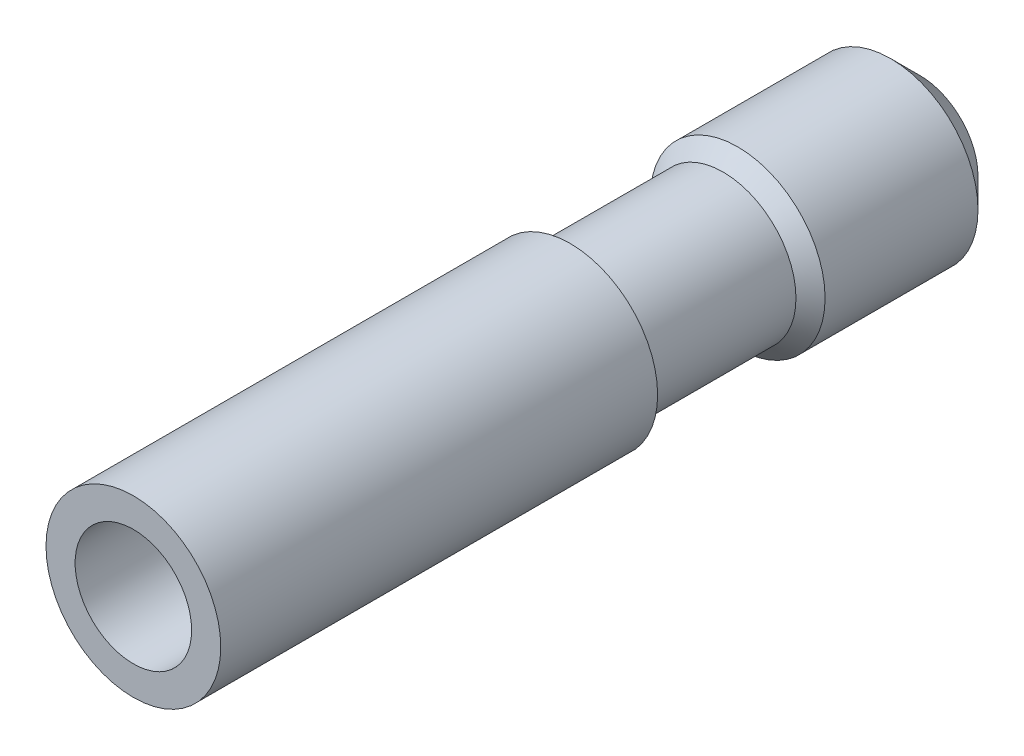
ISO-10303-21;
HEADER;
FILE_DESCRIPTION(('STEP AP214'),'2;1');
FILE_NAME('part.step','',(''),(''),'','','');
FILE_SCHEMA(('AUTOMOTIVE_DESIGN { 1 0 10303 214 1 1 1 1 }'));
ENDSEC;
DATA;
#1=APPLICATION_CONTEXT('core data for automotive mechanical design processes');
#2=APPLICATION_PROTOCOL_DEFINITION('international standard','automotive_design',2000,#1);
#3=PRODUCT_CONTEXT('',#1,'mechanical');
#4=PRODUCT('Part','Part','',(#3));
#5=PRODUCT_RELATED_PRODUCT_CATEGORY('part','',(#4));
#6=PRODUCT_DEFINITION_FORMATION('','',#4);
#7=PRODUCT_DEFINITION_CONTEXT('part definition',#1,'design');
#8=PRODUCT_DEFINITION('design','',#6,#7);
#9=PRODUCT_DEFINITION_SHAPE('','',#8);
#10=(LENGTH_UNIT() NAMED_UNIT(*) SI_UNIT(.MILLI.,.METRE.));
#11=(NAMED_UNIT(*) PLANE_ANGLE_UNIT() SI_UNIT($,.RADIAN.));
#12=(NAMED_UNIT(*) SI_UNIT($,.STERADIAN.) SOLID_ANGLE_UNIT());
#13=UNCERTAINTY_MEASURE_WITH_UNIT(LENGTH_MEASURE(1.E-05),#10,'distance_accuracy_value','');
#14=(GEOMETRIC_REPRESENTATION_CONTEXT(3) GLOBAL_UNCERTAINTY_ASSIGNED_CONTEXT((#13)) GLOBAL_UNIT_ASSIGNED_CONTEXT((#10,
#11,#12)) REPRESENTATION_CONTEXT('',''));
#15=CARTESIAN_POINT('',(0.,0.,0.));
#16=DIRECTION('',(0.,0.,1.));
#17=DIRECTION('',(1.,0.,0.));
#18=AXIS2_PLACEMENT_3D('',#15,#16,#17);
#19=CARTESIAN_POINT('',(0.,0.,27.));
#20=DIRECTION('',(0.,0.,-1.));
#21=DIRECTION('',(-1.,0.,0.));
#22=AXIS2_PLACEMENT_3D('',#19,#20,#21);
#23=CYLINDRICAL_SURFACE('',#22,3.);
#24=CARTESIAN_POINT('',(0.,0.,27.));
#25=DIRECTION('',(0.,0.,1.));
#26=DIRECTION('',(1.,0.,0.));
#27=AXIS2_PLACEMENT_3D('',#24,#25,#26);
#28=CIRCLE('',#27,3.);
#29=CARTESIAN_POINT('',(3.,0.,27.));
#30=VERTEX_POINT('',#29);
#31=EDGE_CURVE('E55',#30,#30,#28,.T.);
#32=ORIENTED_EDGE('',*,*,#31,.F.);
#33=EDGE_LOOP('',(#32));
#34=FACE_BOUND('',#33,.T.);
#35=CARTESIAN_POINT('',(0.,0.,12.));
#36=DIRECTION('',(0.,0.,-1.));
#37=DIRECTION('',(-1.,0.,0.));
#38=AXIS2_PLACEMENT_3D('',#35,#36,#37);
#39=CIRCLE('',#38,3.);
#40=CARTESIAN_POINT('',(-3.,0.,12.));
#41=VERTEX_POINT('',#40);
#42=EDGE_CURVE('E56',#41,#41,#39,.T.);
#43=ORIENTED_EDGE('',*,*,#42,.F.);
#44=EDGE_LOOP('',(#43));
#45=FACE_BOUND('',#44,.T.);
#46=ADVANCED_FACE('F35',(#34,#45),#23,.T.);
#47=CARTESIAN_POINT('',(0.,0.,6.25000000000001));
#48=DIRECTION('',(0.,0.,-1.));
#49=DIRECTION('',(-1.,0.,0.));
#50=AXIS2_PLACEMENT_3D('',#47,#48,#49);
#51=CIRCLE('',#50,3.);
#52=CARTESIAN_POINT('',(-3.,0.,6.25000000000001));
#53=VERTEX_POINT('',#52);
#54=EDGE_CURVE('E10',#53,#53,#51,.T.);
#55=ORIENTED_EDGE('',*,*,#54,.T.);
#56=EDGE_LOOP('',(#55));
#57=FACE_BOUND('',#56,.T.);
#58=CARTESIAN_POINT('',(0.,0.,1.));
#59=DIRECTION('',(0.,0.,1.));
#60=DIRECTION('',(1.,0.,0.));
#61=AXIS2_PLACEMENT_3D('',#58,#59,#60);
#62=CIRCLE('',#61,3.);
#63=CARTESIAN_POINT('',(3.,0.,1.));
#64=VERTEX_POINT('',#63);
#65=EDGE_CURVE('E50',#64,#64,#62,.T.);
#66=ORIENTED_EDGE('',*,*,#65,.T.);
#67=EDGE_LOOP('',(#66));
#68=FACE_BOUND('',#67,.T.);
#69=ADVANCED_FACE('F92',(#57,#68),#23,.T.);
#70=CARTESIAN_POINT('',(0.,0.,27.));
#71=DIRECTION('',(0.,0.,1.));
#72=DIRECTION('',(1.,0.,0.));
#73=AXIS2_PLACEMENT_3D('',#70,#71,#72);
#74=PLANE('',#73);
#75=CARTESIAN_POINT('',(0.,0.,27.));
#76=DIRECTION('',(0.,0.,1.));
#77=DIRECTION('',(1.,0.,0.));
#78=AXIS2_PLACEMENT_3D('',#75,#76,#77);
#79=CIRCLE('',#78,2.);
#80=CARTESIAN_POINT('',(2.,0.,27.));
#81=VERTEX_POINT('',#80);
#82=EDGE_CURVE('E66',#81,#81,#79,.T.);
#83=ORIENTED_EDGE('',*,*,#82,.F.);
#84=EDGE_LOOP('',(#83));
#85=FACE_BOUND('',#84,.T.);
#86=ORIENTED_EDGE('',*,*,#31,.T.);
#87=EDGE_LOOP('',(#86));
#88=FACE_BOUND('',#87,.T.);
#89=ADVANCED_FACE('F98',(#85,#88),#74,.T.);
#90=CARTESIAN_POINT('',(0.,0.,0.));
#91=DIRECTION('',(0.,0.,1.));
#92=DIRECTION('',(1.,0.,0.));
#93=AXIS2_PLACEMENT_3D('',#90,#91,#92);
#94=PLANE('',#93);
#95=CARTESIAN_POINT('',(0.,0.,0.));
#96=DIRECTION('',(0.,0.,1.));
#97=DIRECTION('',(1.,0.,0.));
#98=AXIS2_PLACEMENT_3D('',#95,#96,#97);
#99=CIRCLE('',#98,2.);
#100=CARTESIAN_POINT('',(2.,0.,0.));
#101=VERTEX_POINT('',#100);
#102=EDGE_CURVE('E46',#101,#101,#99,.F.);
#103=ORIENTED_EDGE('',*,*,#102,.T.);
#104=EDGE_LOOP('',(#103));
#105=FACE_BOUND('',#104,.T.);
#106=CARTESIAN_POINT('',(0.,0.,0.));
#107=DIRECTION('',(0.,0.,-1.));
#108=DIRECTION('',(-1.,0.,0.));
#109=AXIS2_PLACEMENT_3D('',#106,#107,#108);
#110=CIRCLE('',#109,1.25);
#111=CARTESIAN_POINT('',(-1.25,0.,0.));
#112=VERTEX_POINT('',#111);
#113=EDGE_CURVE('E59',#112,#112,#110,.T.);
#114=ORIENTED_EDGE('',*,*,#113,.F.);
#115=EDGE_LOOP('',(#114));
#116=FACE_BOUND('',#115,.T.);
#117=ADVANCED_FACE('F102',(#105,#116),#94,.F.);
#118=CARTESIAN_POINT('',(0.,0.,2.5));
#119=DIRECTION('',(0.,0.,1.));
#120=DIRECTION('',(1.,0.,0.));
#121=AXIS2_PLACEMENT_3D('',#118,#119,#120);
#122=CONICAL_SURFACE('',#121,1.99999999999999,1.02974425867665);
#123=CARTESIAN_POINT('',(0.,0.,2.04935453572933));
#124=DIRECTION('',(0.,0.,1.));
#125=DIRECTION('',(1.,0.,0.));
#126=AXIS2_PLACEMENT_3D('',#123,#124,#125);
#127=CIRCLE('',#126,1.25);
#128=CARTESIAN_POINT('',(1.25,0.,2.04935453572933));
#129=VERTEX_POINT('',#128);
#130=EDGE_CURVE('E69',#129,#129,#127,.F.);
#131=ORIENTED_EDGE('',*,*,#130,.T.);
#132=EDGE_LOOP('',(#131));
#133=FACE_BOUND('',#132,.T.);
#134=CARTESIAN_POINT('',(0.,0.,2.5));
#135=DIRECTION('',(0.,0.,1.));
#136=DIRECTION('',(1.,0.,0.));
#137=AXIS2_PLACEMENT_3D('',#134,#135,#136);
#138=CIRCLE('',#137,1.99999999999999);
#139=CARTESIAN_POINT('',(1.99999999999999,0.,2.5));
#140=VERTEX_POINT('',#139);
#141=EDGE_CURVE('E63',#140,#140,#138,.T.);
#142=ORIENTED_EDGE('',*,*,#141,.T.);
#143=EDGE_LOOP('',(#142));
#144=FACE_BOUND('',#143,.T.);
#145=ADVANCED_FACE('F105',(#133,#144),#122,.F.);
#146=CARTESIAN_POINT('',(0.,0.,27.));
#147=DIRECTION('',(0.,0.,1.));
#148=DIRECTION('',(1.,0.,0.));
#149=AXIS2_PLACEMENT_3D('',#146,#147,#148);
#150=CYLINDRICAL_SURFACE('',#149,2.);
#151=ORIENTED_EDGE('',*,*,#141,.F.);
#152=EDGE_LOOP('',(#151));
#153=FACE_BOUND('',#152,.T.);
#154=ORIENTED_EDGE('',*,*,#82,.T.);
#155=EDGE_LOOP('',(#154));
#156=FACE_BOUND('',#155,.T.);
#157=ADVANCED_FACE('F112',(#153,#156),#150,.F.);
#158=CARTESIAN_POINT('',(0.,0.,0.));
#159=DIRECTION('',(0.,0.,-1.));
#160=DIRECTION('',(-1.,0.,0.));
#161=AXIS2_PLACEMENT_3D('',#158,#159,#160);
#162=CYLINDRICAL_SURFACE('',#161,1.25);
#163=ORIENTED_EDGE('',*,*,#113,.T.);
#164=EDGE_LOOP('',(#163));
#165=FACE_BOUND('',#164,.T.);
#166=ORIENTED_EDGE('',*,*,#130,.F.);
#167=EDGE_LOOP('',(#166));
#168=FACE_BOUND('',#167,.T.);
#169=ADVANCED_FACE('F89',(#165,#168),#162,.F.);
#170=CARTESIAN_POINT('',(0.,0.,12.));
#171=DIRECTION('',(0.,0.,-1.));
#172=DIRECTION('',(-1.,0.,0.));
#173=AXIS2_PLACEMENT_3D('',#170,#171,#172);
#174=PLANE('',#173);
#175=CARTESIAN_POINT('',(0.,0.,12.));
#176=DIRECTION('',(0.,0.,1.));
#177=DIRECTION('',(1.,0.,0.));
#178=AXIS2_PLACEMENT_3D('',#175,#176,#177);
#179=CIRCLE('',#178,2.5);
#180=CARTESIAN_POINT('',(2.5,0.,12.));
#181=VERTEX_POINT('',#180);
#182=EDGE_CURVE('E60',#181,#181,#179,.T.);
#183=ORIENTED_EDGE('',*,*,#182,.T.);
#184=EDGE_LOOP('',(#183));
#185=FACE_BOUND('',#184,.T.);
#186=ORIENTED_EDGE('',*,*,#42,.T.);
#187=EDGE_LOOP('',(#186));
#188=FACE_BOUND('',#187,.T.);
#189=ADVANCED_FACE('F77',(#185,#188),#174,.T.);
#190=CARTESIAN_POINT('',(0.,0.,6.));
#191=DIRECTION('',(0.,0.,1.));
#192=DIRECTION('',(1.,0.,0.));
#193=AXIS2_PLACEMENT_3D('',#190,#191,#192);
#194=CYLINDRICAL_SURFACE('',#193,2.5);
#195=CARTESIAN_POINT('',(0.,0.,6.75000000000001));
#196=DIRECTION('',(0.,0.,-1.));
#197=DIRECTION('',(-1.,0.,0.));
#198=AXIS2_PLACEMENT_3D('',#195,#196,#197);
#199=CIRCLE('',#198,2.5);
#200=CARTESIAN_POINT('',(-2.5,0.,6.75000000000001));
#201=VERTEX_POINT('',#200);
#202=EDGE_CURVE('E42',#201,#201,#199,.F.);
#203=ORIENTED_EDGE('',*,*,#202,.T.);
#204=EDGE_LOOP('',(#203));
#205=FACE_BOUND('',#204,.T.);
#206=ORIENTED_EDGE('',*,*,#182,.F.);
#207=EDGE_LOOP('',(#206));
#208=FACE_BOUND('',#207,.T.);
#209=ADVANCED_FACE('F80',(#205,#208),#194,.T.);
#210=CARTESIAN_POINT('',(0.,0.,1.));
#211=DIRECTION('',(0.,0.,1.));
#212=DIRECTION('',(1.,0.,0.));
#213=AXIS2_PLACEMENT_3D('',#210,#211,#212);
#214=CONICAL_SURFACE('',#213,3.,0.78539816339745);
#215=ORIENTED_EDGE('',*,*,#102,.F.);
#216=EDGE_LOOP('',(#215));
#217=FACE_BOUND('',#216,.T.);
#218=ORIENTED_EDGE('',*,*,#65,.F.);
#219=EDGE_LOOP('',(#218));
#220=FACE_BOUND('',#219,.T.);
#221=ADVANCED_FACE('F82',(#217,#220),#214,.T.);
#222=CARTESIAN_POINT('',(0.,0.,6.75000000000001));
#223=DIRECTION('',(0.,0.,-1.));
#224=DIRECTION('',(-1.,0.,0.));
#225=AXIS2_PLACEMENT_3D('',#222,#223,#224);
#226=CONICAL_SURFACE('',#225,2.5,0.785398163397443);
#227=ORIENTED_EDGE('',*,*,#54,.F.);
#228=EDGE_LOOP('',(#227));
#229=FACE_BOUND('',#228,.T.);
#230=ORIENTED_EDGE('',*,*,#202,.F.);
#231=EDGE_LOOP('',(#230));
#232=FACE_BOUND('',#231,.T.);
#233=ADVANCED_FACE('F37',(#229,#232),#226,.T.);
#234=CLOSED_SHELL('',(#46,#69,#89,#117,#145,#157,#169,#189,#209,#221,#233));
#235=MANIFOLD_SOLID_BREP('B2',#234);
#236=ADVANCED_BREP_SHAPE_REPRESENTATION('',(#18,#235),#14);
#237=SHAPE_DEFINITION_REPRESENTATION(#9,#236);
ENDSEC;
END-ISO-10303-21;
